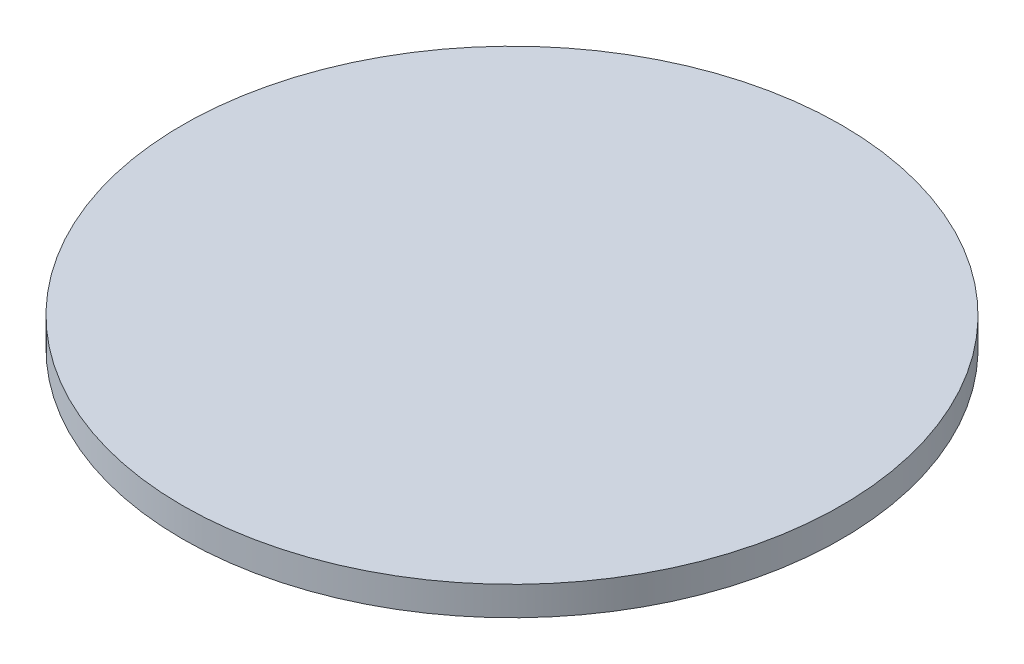
ISO-10303-21;
HEADER;
FILE_DESCRIPTION(('STEP AP214'),'2;1');
FILE_NAME('part.step','',(''),(''),'','','');
FILE_SCHEMA(('AUTOMOTIVE_DESIGN { 1 0 10303 214 1 1 1 1 }'));
ENDSEC;
DATA;
#1=APPLICATION_CONTEXT('core data for automotive mechanical design processes');
#2=APPLICATION_PROTOCOL_DEFINITION('international standard','automotive_design',2000,#1);
#3=PRODUCT_CONTEXT('',#1,'mechanical');
#4=PRODUCT('Part','Part','',(#3));
#5=PRODUCT_RELATED_PRODUCT_CATEGORY('part','',(#4));
#6=PRODUCT_DEFINITION_FORMATION('','',#4);
#7=PRODUCT_DEFINITION_CONTEXT('part definition',#1,'design');
#8=PRODUCT_DEFINITION('design','',#6,#7);
#9=PRODUCT_DEFINITION_SHAPE('','',#8);
#10=(LENGTH_UNIT() NAMED_UNIT(*) SI_UNIT(.MILLI.,.METRE.));
#11=(NAMED_UNIT(*) PLANE_ANGLE_UNIT() SI_UNIT($,.RADIAN.));
#12=(NAMED_UNIT(*) SI_UNIT($,.STERADIAN.) SOLID_ANGLE_UNIT());
#13=UNCERTAINTY_MEASURE_WITH_UNIT(LENGTH_MEASURE(1.E-05),#10,'distance_accuracy_value','');
#14=(GEOMETRIC_REPRESENTATION_CONTEXT(3) GLOBAL_UNCERTAINTY_ASSIGNED_CONTEXT((#13)) GLOBAL_UNIT_ASSIGNED_CONTEXT((#10,
#11,#12)) REPRESENTATION_CONTEXT('',''));
#15=CARTESIAN_POINT('',(0.,0.,0.));
#16=DIRECTION('',(0.,0.,1.));
#17=DIRECTION('',(1.,0.,0.));
#18=AXIS2_PLACEMENT_3D('',#15,#16,#17);
#19=CARTESIAN_POINT('',(0.,4.,0.));
#20=DIRECTION('',(0.,-1.,0.));
#21=DIRECTION('',(0.,0.,-1.));
#22=AXIS2_PLACEMENT_3D('',#19,#20,#21);
#23=CYLINDRICAL_SURFACE('',#22,45.5);
#24=CARTESIAN_POINT('',(0.,4.,0.));
#25=DIRECTION('',(0.,1.,0.));
#26=DIRECTION('',(0.,0.,1.));
#27=AXIS2_PLACEMENT_3D('',#24,#25,#26);
#28=CIRCLE('',#27,45.5);
#29=CARTESIAN_POINT('',(0.,4.,45.5));
#30=VERTEX_POINT('',#29);
#31=EDGE_CURVE('E10',#30,#30,#28,.T.);
#32=ORIENTED_EDGE('',*,*,#31,.F.);
#33=EDGE_LOOP('',(#32));
#34=FACE_BOUND('',#33,.T.);
#35=CARTESIAN_POINT('',(0.,0.,0.));
#36=DIRECTION('',(0.,1.,0.));
#37=DIRECTION('',(0.,0.,1.));
#38=AXIS2_PLACEMENT_3D('',#35,#36,#37);
#39=CIRCLE('',#38,45.5);
#40=CARTESIAN_POINT('',(0.,0.,45.5));
#41=VERTEX_POINT('',#40);
#42=EDGE_CURVE('E42',#41,#41,#39,.T.);
#43=ORIENTED_EDGE('',*,*,#42,.T.);
#44=EDGE_LOOP('',(#43));
#45=FACE_BOUND('',#44,.T.);
#46=ADVANCED_FACE('F41',(#34,#45),#23,.T.);
#47=CARTESIAN_POINT('',(0.,4.,0.));
#48=DIRECTION('',(0.,1.,0.));
#49=DIRECTION('',(0.,0.,1.));
#50=AXIS2_PLACEMENT_3D('',#47,#48,#49);
#51=PLANE('',#50);
#52=ORIENTED_EDGE('',*,*,#31,.T.);
#53=EDGE_LOOP('',(#52));
#54=FACE_BOUND('',#53,.T.);
#55=ADVANCED_FACE('F89',(#54),#51,.T.);
#56=CARTESIAN_POINT('',(0.,0.,0.));
#57=DIRECTION('',(0.,1.,0.));
#58=DIRECTION('',(0.,0.,1.));
#59=AXIS2_PLACEMENT_3D('',#56,#57,#58);
#60=PLANE('',#59);
#61=CARTESIAN_POINT('',(0.,0.,25.));
#62=DIRECTION('',(0.,-1.,0.));
#63=DIRECTION('',(0.,0.,-1.));
#64=AXIS2_PLACEMENT_3D('',#61,#62,#63);
#65=CIRCLE('',#64,3.);
#66=CARTESIAN_POINT('',(0.,0.,22.));
#67=VERTEX_POINT('',#66);
#68=EDGE_CURVE('E72',#67,#67,#65,.T.);
#69=ORIENTED_EDGE('',*,*,#68,.F.);
#70=EDGE_LOOP('',(#69));
#71=FACE_BOUND('',#70,.T.);
#72=CARTESIAN_POINT('',(25.,0.,0.));
#73=DIRECTION('',(0.,-1.,0.));
#74=DIRECTION('',(0.,0.,-1.));
#75=AXIS2_PLACEMENT_3D('',#72,#73,#74);
#76=CIRCLE('',#75,3.);
#77=CARTESIAN_POINT('',(25.,0.,-3.00000000000009));
#78=VERTEX_POINT('',#77);
#79=EDGE_CURVE('E68',#78,#78,#76,.T.);
#80=ORIENTED_EDGE('',*,*,#79,.F.);
#81=EDGE_LOOP('',(#80));
#82=FACE_BOUND('',#81,.T.);
#83=CARTESIAN_POINT('',(-1.74574066942157E-13,0.,-25.));
#84=DIRECTION('',(0.,-1.,0.));
#85=DIRECTION('',(0.,0.,-1.));
#86=AXIS2_PLACEMENT_3D('',#83,#84,#85);
#87=CIRCLE('',#86,3.);
#88=CARTESIAN_POINT('',(-1.74574066942157E-13,0.,-28.));
#89=VERTEX_POINT('',#88);
#90=EDGE_CURVE('E65',#89,#89,#87,.T.);
#91=ORIENTED_EDGE('',*,*,#90,.F.);
#92=EDGE_LOOP('',(#91));
#93=FACE_BOUND('',#92,.T.);
#94=CARTESIAN_POINT('',(-25.,0.,2.61861100413235E-13));
#95=DIRECTION('',(0.,-1.,0.));
#96=DIRECTION('',(0.,0.,-1.));
#97=AXIS2_PLACEMENT_3D('',#94,#95,#96);
#98=CIRCLE('',#97,3.);
#99=CARTESIAN_POINT('',(-25.,0.,-2.99999999999974));
#100=VERTEX_POINT('',#99);
#101=EDGE_CURVE('E57',#100,#100,#98,.T.);
#102=ORIENTED_EDGE('',*,*,#101,.F.);
#103=EDGE_LOOP('',(#102));
#104=FACE_BOUND('',#103,.T.);
#105=ORIENTED_EDGE('',*,*,#42,.F.);
#106=EDGE_LOOP('',(#105));
#107=FACE_BOUND('',#106,.T.);
#108=ADVANCED_FACE('F88',(#71,#82,#93,#104,#107),#60,.F.);
#109=CARTESIAN_POINT('',(-25.,3.,2.61861100413235E-13));
#110=DIRECTION('',(0.,-1.,0.));
#111=DIRECTION('',(0.,0.,-1.));
#112=AXIS2_PLACEMENT_3D('',#109,#110,#111);
#113=CYLINDRICAL_SURFACE('',#112,3.);
#114=CARTESIAN_POINT('',(-25.,3.,2.61861100413235E-13));
#115=DIRECTION('',(0.,-1.,0.));
#116=DIRECTION('',(0.,0.,-1.));
#117=AXIS2_PLACEMENT_3D('',#114,#115,#116);
#118=CIRCLE('',#117,3.);
#119=CARTESIAN_POINT('',(-25.,3.,-2.99999999999974));
#120=VERTEX_POINT('',#119);
#121=EDGE_CURVE('E52',#120,#120,#118,.T.);
#122=ORIENTED_EDGE('',*,*,#121,.F.);
#123=EDGE_LOOP('',(#122));
#124=FACE_BOUND('',#123,.T.);
#125=ORIENTED_EDGE('',*,*,#101,.T.);
#126=EDGE_LOOP('',(#125));
#127=FACE_BOUND('',#126,.T.);
#128=ADVANCED_FACE('F90',(#124,#127),#113,.F.);
#129=CARTESIAN_POINT('',(-25.,3.,2.61861100413235E-13));
#130=DIRECTION('',(0.,-1.,0.));
#131=DIRECTION('',(0.,0.,-1.));
#132=AXIS2_PLACEMENT_3D('',#129,#130,#131);
#133=PLANE('',#132);
#134=ORIENTED_EDGE('',*,*,#121,.T.);
#135=EDGE_LOOP('',(#134));
#136=FACE_BOUND('',#135,.T.);
#137=ADVANCED_FACE('F107',(#136),#133,.T.);
#138=CARTESIAN_POINT('',(-1.74574066942157E-13,3.,-25.));
#139=DIRECTION('',(0.,-1.,0.));
#140=DIRECTION('',(0.,0.,-1.));
#141=AXIS2_PLACEMENT_3D('',#138,#139,#140);
#142=CYLINDRICAL_SURFACE('',#141,3.);
#143=CARTESIAN_POINT('',(-1.74574066942157E-13,3.,-25.));
#144=DIRECTION('',(0.,-1.,0.));
#145=DIRECTION('',(0.,0.,-1.));
#146=AXIS2_PLACEMENT_3D('',#143,#144,#145);
#147=CIRCLE('',#146,3.);
#148=CARTESIAN_POINT('',(-1.74574066942157E-13,3.,-28.));
#149=VERTEX_POINT('',#148);
#150=EDGE_CURVE('E56',#149,#149,#147,.T.);
#151=ORIENTED_EDGE('',*,*,#150,.F.);
#152=EDGE_LOOP('',(#151));
#153=FACE_BOUND('',#152,.T.);
#154=ORIENTED_EDGE('',*,*,#90,.T.);
#155=EDGE_LOOP('',(#154));
#156=FACE_BOUND('',#155,.T.);
#157=ADVANCED_FACE('F112',(#153,#156),#142,.F.);
#158=CARTESIAN_POINT('',(-1.74574066942157E-13,3.,-25.));
#159=DIRECTION('',(0.,-1.,0.));
#160=DIRECTION('',(0.,0.,-1.));
#161=AXIS2_PLACEMENT_3D('',#158,#159,#160);
#162=PLANE('',#161);
#163=ORIENTED_EDGE('',*,*,#150,.T.);
#164=EDGE_LOOP('',(#163));
#165=FACE_BOUND('',#164,.T.);
#166=ADVANCED_FACE('F117',(#165),#162,.T.);
#167=CARTESIAN_POINT('',(25.,3.,0.));
#168=DIRECTION('',(0.,-1.,0.));
#169=DIRECTION('',(0.,0.,-1.));
#170=AXIS2_PLACEMENT_3D('',#167,#168,#169);
#171=CYLINDRICAL_SURFACE('',#170,3.);
#172=CARTESIAN_POINT('',(25.,3.,0.));
#173=DIRECTION('',(0.,-1.,0.));
#174=DIRECTION('',(0.,0.,-1.));
#175=AXIS2_PLACEMENT_3D('',#172,#173,#174);
#176=CIRCLE('',#175,3.);
#177=CARTESIAN_POINT('',(25.,3.,-3.00000000000009));
#178=VERTEX_POINT('',#177);
#179=EDGE_CURVE('E63',#178,#178,#176,.T.);
#180=ORIENTED_EDGE('',*,*,#179,.F.);
#181=EDGE_LOOP('',(#180));
#182=FACE_BOUND('',#181,.T.);
#183=ORIENTED_EDGE('',*,*,#79,.T.);
#184=EDGE_LOOP('',(#183));
#185=FACE_BOUND('',#184,.T.);
#186=ADVANCED_FACE('F116',(#182,#185),#171,.F.);
#187=CARTESIAN_POINT('',(25.,3.,0.));
#188=DIRECTION('',(0.,-1.,0.));
#189=DIRECTION('',(0.,0.,-1.));
#190=AXIS2_PLACEMENT_3D('',#187,#188,#189);
#191=PLANE('',#190);
#192=ORIENTED_EDGE('',*,*,#179,.T.);
#193=EDGE_LOOP('',(#192));
#194=FACE_BOUND('',#193,.T.);
#195=ADVANCED_FACE('F85',(#194),#191,.T.);
#196=CARTESIAN_POINT('',(0.,3.,25.));
#197=DIRECTION('',(0.,-1.,0.));
#198=DIRECTION('',(0.,0.,-1.));
#199=AXIS2_PLACEMENT_3D('',#196,#197,#198);
#200=CYLINDRICAL_SURFACE('',#199,3.);
#201=CARTESIAN_POINT('',(0.,3.,25.));
#202=DIRECTION('',(0.,-1.,0.));
#203=DIRECTION('',(0.,0.,-1.));
#204=AXIS2_PLACEMENT_3D('',#201,#202,#203);
#205=CIRCLE('',#204,3.);
#206=CARTESIAN_POINT('',(0.,3.,22.));
#207=VERTEX_POINT('',#206);
#208=EDGE_CURVE('E51',#207,#207,#205,.T.);
#209=ORIENTED_EDGE('',*,*,#208,.F.);
#210=EDGE_LOOP('',(#209));
#211=FACE_BOUND('',#210,.T.);
#212=ORIENTED_EDGE('',*,*,#68,.T.);
#213=EDGE_LOOP('',(#212));
#214=FACE_BOUND('',#213,.T.);
#215=ADVANCED_FACE('F76',(#211,#214),#200,.F.);
#216=CARTESIAN_POINT('',(0.,3.,25.));
#217=DIRECTION('',(0.,-1.,0.));
#218=DIRECTION('',(0.,0.,-1.));
#219=AXIS2_PLACEMENT_3D('',#216,#217,#218);
#220=PLANE('',#219);
#221=ORIENTED_EDGE('',*,*,#208,.T.);
#222=EDGE_LOOP('',(#221));
#223=FACE_BOUND('',#222,.T.);
#224=ADVANCED_FACE('F80',(#223),#220,.T.);
#225=CLOSED_SHELL('',(#46,#55,#108,#128,#137,#157,#166,#186,#195,#215,#224));
#226=MANIFOLD_SOLID_BREP('B2',#225);
#227=ADVANCED_BREP_SHAPE_REPRESENTATION('',(#18,#226),#14);
#228=SHAPE_DEFINITION_REPRESENTATION(#9,#227);
ENDSEC;
END-ISO-10303-21;
